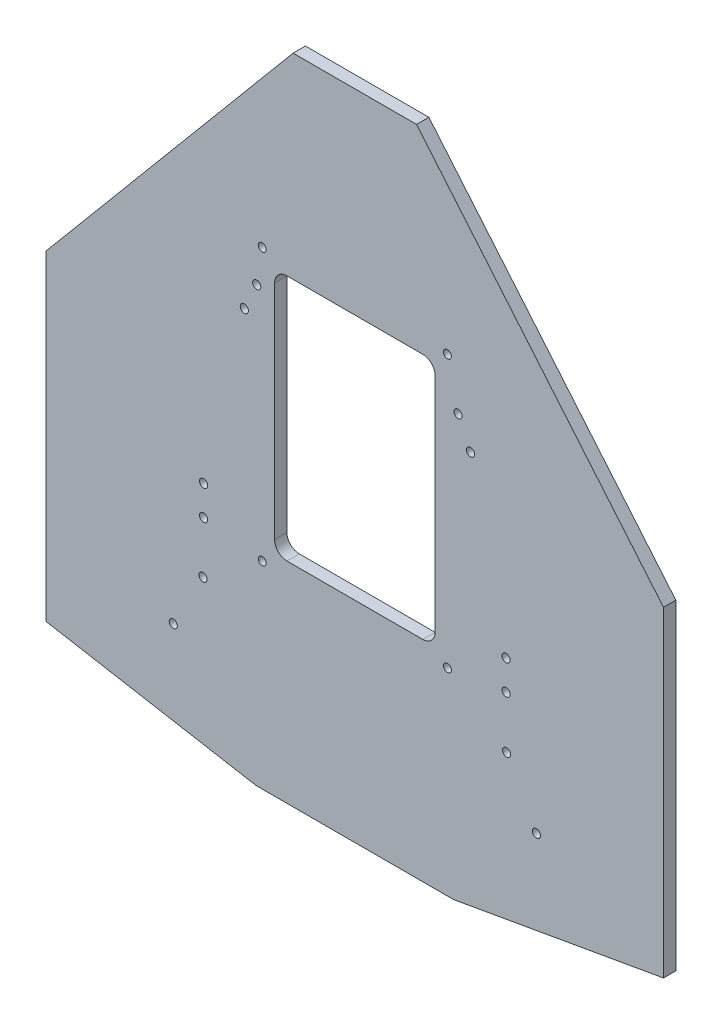
ISO-10303-21;
HEADER;
FILE_DESCRIPTION(('STEP AP214'),'2;1');
FILE_NAME('part.step','',(''),(''),'','','');
FILE_SCHEMA(('AUTOMOTIVE_DESIGN { 1 0 10303 214 1 1 1 1 }'));
ENDSEC;
DATA;
#1=APPLICATION_CONTEXT('core data for automotive mechanical design processes');
#2=APPLICATION_PROTOCOL_DEFINITION('international standard','automotive_design',2000,#1);
#3=PRODUCT_CONTEXT('',#1,'mechanical');
#4=PRODUCT('Part','Part','',(#3));
#5=PRODUCT_RELATED_PRODUCT_CATEGORY('part','',(#4));
#6=PRODUCT_DEFINITION_FORMATION('','',#4);
#7=PRODUCT_DEFINITION_CONTEXT('part definition',#1,'design');
#8=PRODUCT_DEFINITION('design','',#6,#7);
#9=PRODUCT_DEFINITION_SHAPE('','',#8);
#10=(LENGTH_UNIT() NAMED_UNIT(*) SI_UNIT(.MILLI.,.METRE.));
#11=(NAMED_UNIT(*) PLANE_ANGLE_UNIT() SI_UNIT($,.RADIAN.));
#12=(NAMED_UNIT(*) SI_UNIT($,.STERADIAN.) SOLID_ANGLE_UNIT());
#13=UNCERTAINTY_MEASURE_WITH_UNIT(LENGTH_MEASURE(1.E-05),#10,'distance_accuracy_value','');
#14=(GEOMETRIC_REPRESENTATION_CONTEXT(3) GLOBAL_UNCERTAINTY_ASSIGNED_CONTEXT((#13)) GLOBAL_UNIT_ASSIGNED_CONTEXT((#10,
#11,#12)) REPRESENTATION_CONTEXT('',''));
#15=CARTESIAN_POINT('',(0.,0.,0.));
#16=DIRECTION('',(0.,0.,1.));
#17=DIRECTION('',(1.,0.,0.));
#18=AXIS2_PLACEMENT_3D('',#15,#16,#17);
#19=CARTESIAN_POINT('',(0.,0.,5.));
#20=DIRECTION('',(0.,0.,1.));
#21=DIRECTION('',(1.,0.,0.));
#22=AXIS2_PLACEMENT_3D('',#19,#20,#21);
#23=PLANE('',#22);
#24=CARTESIAN_POINT('',(16.4710957722156,-32.9999999999997,5.));
#25=DIRECTION('',(0.,0.,1.));
#26=DIRECTION('',(1.,0.,0.));
#27=AXIS2_PLACEMENT_3D('',#24,#25,#26);
#28=CIRCLE('',#27,1.65);
#29=CARTESIAN_POINT('',(18.1210957722156,-32.9999999999997,5.));
#30=VERTEX_POINT('',#29);
#31=EDGE_CURVE('E298',#30,#30,#28,.T.);
#32=ORIENTED_EDGE('',*,*,#31,.F.);
#33=EDGE_LOOP('',(#32));
#34=FACE_BOUND('',#33,.T.);
#35=CARTESIAN_POINT('',(163.528904227811,-32.9999999999996,5.));
#36=DIRECTION('',(0.,0.,1.));
#37=DIRECTION('',(1.,0.,0.));
#38=AXIS2_PLACEMENT_3D('',#35,#36,#37);
#39=CIRCLE('',#38,1.64999999999999);
#40=CARTESIAN_POINT('',(165.178904227811,-32.9999999999996,5.));
#41=VERTEX_POINT('',#40);
#42=EDGE_CURVE('E314',#41,#41,#39,.T.);
#43=ORIENTED_EDGE('',*,*,#42,.F.);
#44=EDGE_LOOP('',(#43));
#45=FACE_BOUND('',#44,.T.);
#46=CARTESIAN_POINT('',(151.250000000029,22.3600000000004,5.));
#47=DIRECTION('',(0.,0.,1.));
#48=DIRECTION('',(1.,0.,0.));
#49=AXIS2_PLACEMENT_3D('',#46,#47,#48);
#50=CIRCLE('',#49,1.64999999999999);
#51=CARTESIAN_POINT('',(152.900000000029,22.3600000000004,5.));
#52=VERTEX_POINT('',#51);
#53=EDGE_CURVE('E317',#52,#52,#50,.T.);
#54=ORIENTED_EDGE('',*,*,#53,.F.);
#55=EDGE_LOOP('',(#54));
#56=FACE_BOUND('',#55,.T.);
#57=CARTESIAN_POINT('',(151.250000000029,10.3600000000004,5.));
#58=DIRECTION('',(0.,0.,1.));
#59=DIRECTION('',(1.,0.,0.));
#60=AXIS2_PLACEMENT_3D('',#57,#58,#59);
#61=CIRCLE('',#60,1.64999999999999);
#62=CARTESIAN_POINT('',(152.900000000029,10.3600000000004,5.));
#63=VERTEX_POINT('',#62);
#64=EDGE_CURVE('E320',#63,#63,#61,.T.);
#65=ORIENTED_EDGE('',*,*,#64,.F.);
#66=EDGE_LOOP('',(#65));
#67=FACE_BOUND('',#66,.T.);
#68=CARTESIAN_POINT('',(151.471095772246,-10.6399999999996,5.));
#69=DIRECTION('',(0.,0.,1.));
#70=DIRECTION('',(1.,0.,0.));
#71=AXIS2_PLACEMENT_3D('',#68,#69,#70);
#72=CIRCLE('',#71,1.64999999999999);
#73=CARTESIAN_POINT('',(153.121095772246,-10.6399999999996,5.));
#74=VERTEX_POINT('',#73);
#75=EDGE_CURVE('E323',#74,#74,#72,.T.);
#76=ORIENTED_EDGE('',*,*,#75,.F.);
#77=EDGE_LOOP('',(#76));
#78=FACE_BOUND('',#77,.T.);
#79=CARTESIAN_POINT('',(136.849782998851,87.3443514030201,5.));
#80=DIRECTION('',(0.,0.,1.));
#81=DIRECTION('',(1.,0.,0.));
#82=AXIS2_PLACEMENT_3D('',#79,#80,#81);
#83=CIRCLE('',#82,1.64999999999999);
#84=CARTESIAN_POINT('',(138.499782998851,87.3443514030201,5.));
#85=VERTEX_POINT('',#84);
#86=EDGE_CURVE('E326',#85,#85,#83,.T.);
#87=ORIENTED_EDGE('',*,*,#86,.F.);
#88=EDGE_LOOP('',(#87));
#89=FACE_BOUND('',#88,.T.);
#90=CARTESIAN_POINT('',(131.82108486931,98.2398640170255,5.));
#91=DIRECTION('',(0.,0.,1.));
#92=DIRECTION('',(1.,0.,0.));
#93=AXIS2_PLACEMENT_3D('',#90,#91,#92);
#94=CIRCLE('',#93,1.64999999999999);
#95=CARTESIAN_POINT('',(133.47108486931,98.2398640170255,5.));
#96=VERTEX_POINT('',#95);
#97=EDGE_CURVE('E329',#96,#96,#94,.T.);
#98=ORIENTED_EDGE('',*,*,#97,.F.);
#99=EDGE_LOOP('',(#98));
#100=FACE_BOUND('',#99,.T.);
#101=CARTESIAN_POINT('',(50.2742777327034,102.779816321387,5.));
#102=DIRECTION('',(0.,0.,1.));
#103=DIRECTION('',(1.,0.,0.));
#104=AXIS2_PLACEMENT_3D('',#101,#102,#103);
#105=CIRCLE('',#104,1.65);
#106=CARTESIAN_POINT('',(51.9242777327034,102.779816321387,5.));
#107=VERTEX_POINT('',#106);
#108=EDGE_CURVE('E332',#107,#107,#105,.T.);
#109=ORIENTED_EDGE('',*,*,#108,.F.);
#110=EDGE_LOOP('',(#109));
#111=FACE_BOUND('',#110,.T.);
#112=CARTESIAN_POINT('',(28.5289042277807,-10.6399999999997,5.));
#113=DIRECTION('',(0.,0.,1.));
#114=DIRECTION('',(1.,0.,0.));
#115=AXIS2_PLACEMENT_3D('',#112,#113,#114);
#116=CIRCLE('',#115,1.65);
#117=CARTESIAN_POINT('',(30.1789042277807,-10.6399999999997,5.));
#118=VERTEX_POINT('',#117);
#119=EDGE_CURVE('E335',#118,#118,#116,.T.);
#120=ORIENTED_EDGE('',*,*,#119,.F.);
#121=EDGE_LOOP('',(#120));
#122=FACE_BOUND('',#121,.T.);
#123=CARTESIAN_POINT('',(28.7499999999981,22.3600000000003,5.));
#124=DIRECTION('',(0.,0.,1.));
#125=DIRECTION('',(1.,0.,0.));
#126=AXIS2_PLACEMENT_3D('',#123,#124,#125);
#127=CIRCLE('',#126,1.65);
#128=CARTESIAN_POINT('',(30.3999999999981,22.3600000000003,5.));
#129=VERTEX_POINT('',#128);
#130=EDGE_CURVE('E338',#129,#129,#127,.T.);
#131=ORIENTED_EDGE('',*,*,#130,.F.);
#132=EDGE_LOOP('',(#131));
#133=FACE_BOUND('',#132,.T.);
#134=CARTESIAN_POINT('',(28.7499999999981,10.3600000000003,5.));
#135=DIRECTION('',(0.,0.,1.));
#136=DIRECTION('',(1.,0.,0.));
#137=AXIS2_PLACEMENT_3D('',#134,#135,#136);
#138=CIRCLE('',#137,1.65);
#139=CARTESIAN_POINT('',(30.3999999999981,10.3600000000003,5.));
#140=VERTEX_POINT('',#139);
#141=EDGE_CURVE('E341',#140,#140,#138,.T.);
#142=ORIENTED_EDGE('',*,*,#141,.F.);
#143=EDGE_LOOP('',(#142));
#144=FACE_BOUND('',#143,.T.);
#145=CARTESIAN_POINT('',(45.2455796031625,91.8843037073813,5.));
#146=DIRECTION('',(0.,0.,1.));
#147=DIRECTION('',(1.,0.,0.));
#148=AXIS2_PLACEMENT_3D('',#145,#146,#147);
#149=CIRCLE('',#148,1.65);
#150=CARTESIAN_POINT('',(46.8955796031625,91.8843037073813,5.));
#151=VERTEX_POINT('',#150);
#152=EDGE_CURVE('E344',#151,#151,#149,.T.);
#153=ORIENTED_EDGE('',*,*,#152,.F.);
#154=EDGE_LOOP('',(#153));
#155=FACE_BOUND('',#154,.T.);
#156=CARTESIAN_POINT('',(52.5000000000139,117.,5.));
#157=DIRECTION('',(0.,0.,1.));
#158=DIRECTION('',(1.,0.,0.));
#159=AXIS2_PLACEMENT_3D('',#156,#157,#158);
#160=CIRCLE('',#159,1.60000000003971);
#161=CARTESIAN_POINT('',(54.1000000000536,117.,5.));
#162=VERTEX_POINT('',#161);
#163=EDGE_CURVE('E307',#162,#162,#160,.T.);
#164=ORIENTED_EDGE('',*,*,#163,.F.);
#165=EDGE_LOOP('',(#164));
#166=FACE_BOUND('',#165,.T.);
#167=CARTESIAN_POINT('',(127.500000000014,6.99999999999999,5.));
#168=DIRECTION('',(0.,0.,1.));
#169=DIRECTION('',(1.,0.,0.));
#170=AXIS2_PLACEMENT_3D('',#167,#168,#169);
#171=CIRCLE('',#170,1.60000000003971);
#172=CARTESIAN_POINT('',(129.100000000054,6.99999999999999,5.));
#173=VERTEX_POINT('',#172);
#174=EDGE_CURVE('E301',#173,#173,#171,.T.);
#175=ORIENTED_EDGE('',*,*,#174,.F.);
#176=EDGE_LOOP('',(#175));
#177=FACE_BOUND('',#176,.T.);
#178=CARTESIAN_POINT('',(127.500000000014,117.,5.));
#179=DIRECTION('',(0.,0.,1.));
#180=DIRECTION('',(1.,0.,0.));
#181=AXIS2_PLACEMENT_3D('',#178,#179,#180);
#182=CIRCLE('',#181,1.60000000003971);
#183=CARTESIAN_POINT('',(129.100000000054,117.,5.));
#184=VERTEX_POINT('',#183);
#185=EDGE_CURVE('E294',#184,#184,#182,.T.);
#186=ORIENTED_EDGE('',*,*,#185,.F.);
#187=EDGE_LOOP('',(#186));
#188=FACE_BOUND('',#187,.T.);
#189=CARTESIAN_POINT('',(52.5000000000139,6.99999999999998,5.));
#190=DIRECTION('',(0.,0.,1.));
#191=DIRECTION('',(1.,0.,0.));
#192=AXIS2_PLACEMENT_3D('',#189,#190,#191);
#193=CIRCLE('',#192,1.60000000003971);
#194=CARTESIAN_POINT('',(54.1000000000536,6.99999999999998,5.));
#195=VERTEX_POINT('',#194);
#196=EDGE_CURVE('E288',#195,#195,#193,.T.);
#197=ORIENTED_EDGE('',*,*,#196,.F.);
#198=EDGE_LOOP('',(#197));
#199=FACE_BOUND('',#198,.T.);
#200=DIRECTION('',(0.,-1.,0.));
#201=VECTOR('',#200,1.);
#202=CARTESIAN_POINT('',(-34.9999999999858,-48.,5.));
#203=LINE('',#202,#201);
#204=CARTESIAN_POINT('',(-34.9999999999858,72.0000000000001,5.));
#205=VERTEX_POINT('',#204);
#206=CARTESIAN_POINT('',(-34.9999999999858,-58.,5.));
#207=VERTEX_POINT('',#206);
#208=EDGE_CURVE('E151',#205,#207,#203,.T.);
#209=ORIENTED_EDGE('',*,*,#208,.T.);
#210=DIRECTION('',(0.984783558817937,-0.173785333909048,0.));
#211=VECTOR('',#210,1.);
#212=CARTESIAN_POINT('',(-34.9999999999858,-58.,5.));
#213=LINE('',#212,#211);
#214=CARTESIAN_POINT('',(50.0000000000139,-73.,5.));
#215=VERTEX_POINT('',#214);
#216=EDGE_CURVE('E154',#207,#215,#213,.T.);
#217=ORIENTED_EDGE('',*,*,#216,.T.);
#218=DIRECTION('',(1.,0.,0.));
#219=VECTOR('',#218,1.);
#220=CARTESIAN_POINT('',(50.0000000000139,-73.,5.));
#221=LINE('',#220,#219);
#222=CARTESIAN_POINT('',(130.000000000014,-73.,5.));
#223=VERTEX_POINT('',#222);
#224=EDGE_CURVE('E175',#215,#223,#221,.T.);
#225=ORIENTED_EDGE('',*,*,#224,.T.);
#226=DIRECTION('',(0.984783558817937,0.173785333909048,0.));
#227=VECTOR('',#226,1.);
#228=CARTESIAN_POINT('',(130.000000000014,-73.,5.));
#229=LINE('',#228,#227);
#230=CARTESIAN_POINT('',(215.000000000014,-58.,5.));
#231=VERTEX_POINT('',#230);
#232=EDGE_CURVE('E177',#223,#231,#229,.T.);
#233=ORIENTED_EDGE('',*,*,#232,.T.);
#234=DIRECTION('',(0.,1.,0.));
#235=VECTOR('',#234,1.);
#236=CARTESIAN_POINT('',(215.000000000014,-58.,5.));
#237=LINE('',#236,#235);
#238=CARTESIAN_POINT('',(215.000000000014,72.0000000000001,5.));
#239=VERTEX_POINT('',#238);
#240=EDGE_CURVE('E182',#231,#239,#237,.T.);
#241=ORIENTED_EDGE('',*,*,#240,.T.);
#242=DIRECTION('',(-0.642202735348072,0.766534830722945,0.));
#243=VECTOR('',#242,1.);
#244=CARTESIAN_POINT('',(215.000000000014,72.0000000000001,5.));
#245=LINE('',#244,#243);
#246=CARTESIAN_POINT('',(115.000000000015,191.360256275999,5.));
#247=VERTEX_POINT('',#246);
#248=EDGE_CURVE('E184',#239,#247,#245,.T.);
#249=ORIENTED_EDGE('',*,*,#248,.T.);
#250=DIRECTION('',(-1.,0.,0.));
#251=VECTOR('',#250,1.);
#252=CARTESIAN_POINT('',(115.000000000015,191.360256275999,5.));
#253=LINE('',#252,#251);
#254=CARTESIAN_POINT('',(65.0000000000152,191.360256275999,5.));
#255=VERTEX_POINT('',#254);
#256=EDGE_CURVE('E186',#247,#255,#253,.T.);
#257=ORIENTED_EDGE('',*,*,#256,.T.);
#258=DIRECTION('',(-0.642202735348082,-0.766534830722937,0.));
#259=VECTOR('',#258,1.);
#260=CARTESIAN_POINT('',(65.0000000000152,191.360256275999,5.));
#261=LINE('',#260,#259);
#262=EDGE_CURVE('E157',#255,#205,#261,.T.);
#263=ORIENTED_EDGE('',*,*,#262,.T.);
#264=EDGE_LOOP('',(#209,#217,#225,#233,#241,#249,#257,#263));
#265=FACE_BOUND('',#264,.T.);
#266=DIRECTION('',(0.,-1.,0.));
#267=VECTOR('',#266,1.);
#268=CARTESIAN_POINT('',(57.5000000000139,112.,5.));
#269=LINE('',#268,#267);
#270=CARTESIAN_POINT('',(57.5000000000139,107.,5.));
#271=VERTEX_POINT('',#270);
#272=CARTESIAN_POINT('',(57.5000000000139,17.,5.));
#273=VERTEX_POINT('',#272);
#274=EDGE_CURVE('E277',#271,#273,#269,.T.);
#275=ORIENTED_EDGE('',*,*,#274,.F.);
#276=CARTESIAN_POINT('',(62.5000000000139,107.,5.));
#277=DIRECTION('',(0.,0.,1.));
#278=DIRECTION('',(1.,0.,0.));
#279=AXIS2_PLACEMENT_3D('',#276,#277,#278);
#280=CIRCLE('',#279,5.);
#281=CARTESIAN_POINT('',(62.5000000000139,112.,5.));
#282=VERTEX_POINT('',#281);
#283=EDGE_CURVE('E53',#271,#282,#280,.F.);
#284=ORIENTED_EDGE('',*,*,#283,.T.);
#285=DIRECTION('',(-1.,0.,0.));
#286=VECTOR('',#285,1.);
#287=CARTESIAN_POINT('',(122.500000000014,112.,5.));
#288=LINE('',#287,#286);
#289=CARTESIAN_POINT('',(117.500000000014,112.,5.));
#290=VERTEX_POINT('',#289);
#291=EDGE_CURVE('E270',#290,#282,#288,.T.);
#292=ORIENTED_EDGE('',*,*,#291,.F.);
#293=CARTESIAN_POINT('',(117.500000000014,107.,5.));
#294=DIRECTION('',(0.,0.,1.));
#295=DIRECTION('',(1.,0.,0.));
#296=AXIS2_PLACEMENT_3D('',#293,#294,#295);
#297=CIRCLE('',#296,5.);
#298=CARTESIAN_POINT('',(122.500000000014,107.,5.));
#299=VERTEX_POINT('',#298);
#300=EDGE_CURVE('E11',#290,#299,#297,.F.);
#301=ORIENTED_EDGE('',*,*,#300,.T.);
#302=DIRECTION('',(0.,1.,0.));
#303=VECTOR('',#302,1.);
#304=CARTESIAN_POINT('',(122.500000000014,112.,5.));
#305=LINE('',#304,#303);
#306=CARTESIAN_POINT('',(122.500000000014,17.,5.));
#307=VERTEX_POINT('',#306);
#308=EDGE_CURVE('E193',#307,#299,#305,.T.);
#309=ORIENTED_EDGE('',*,*,#308,.F.);
#310=CARTESIAN_POINT('',(117.500000000014,17.,5.));
#311=DIRECTION('',(0.,0.,1.));
#312=DIRECTION('',(1.,0.,0.));
#313=AXIS2_PLACEMENT_3D('',#310,#311,#312);
#314=CIRCLE('',#313,5.);
#315=CARTESIAN_POINT('',(117.500000000014,12.,5.));
#316=VERTEX_POINT('',#315);
#317=EDGE_CURVE('E244',#307,#316,#314,.F.);
#318=ORIENTED_EDGE('',*,*,#317,.T.);
#319=DIRECTION('',(1.,0.,0.));
#320=VECTOR('',#319,1.);
#321=CARTESIAN_POINT('',(122.500000000014,12.,5.));
#322=LINE('',#321,#320);
#323=CARTESIAN_POINT('',(62.5000000000139,12.,5.));
#324=VERTEX_POINT('',#323);
#325=EDGE_CURVE('E274',#324,#316,#322,.T.);
#326=ORIENTED_EDGE('',*,*,#325,.F.);
#327=CARTESIAN_POINT('',(62.5000000000139,17.,5.));
#328=DIRECTION('',(0.,0.,1.));
#329=DIRECTION('',(1.,0.,0.));
#330=AXIS2_PLACEMENT_3D('',#327,#328,#329);
#331=CIRCLE('',#330,5.);
#332=EDGE_CURVE('E248',#324,#273,#331,.F.);
#333=ORIENTED_EDGE('',*,*,#332,.T.);
#334=EDGE_LOOP('',(#275,#284,#292,#301,#309,#318,#326,#333));
#335=FACE_BOUND('',#334,.T.);
#336=ADVANCED_FACE('F38',(#34,#45,#56,#67,#78,#89,#100,#111,#122,#133,#144,#155,#166,#177,#188,
#199,#265,#335),#23,.T.);
#337=CARTESIAN_POINT('',(0.,0.,0.));
#338=DIRECTION('',(0.,0.,1.));
#339=DIRECTION('',(1.,0.,0.));
#340=AXIS2_PLACEMENT_3D('',#337,#338,#339);
#341=PLANE('',#340);
#342=CARTESIAN_POINT('',(16.4710957722156,-32.9999999999997,0.));
#343=DIRECTION('',(0.,0.,-1.));
#344=DIRECTION('',(-1.,0.,0.));
#345=AXIS2_PLACEMENT_3D('',#342,#343,#344);
#346=CIRCLE('',#345,1.65);
#347=CARTESIAN_POINT('',(14.8210957722156,-32.9999999999997,0.));
#348=VERTEX_POINT('',#347);
#349=EDGE_CURVE('E347',#348,#348,#346,.T.);
#350=ORIENTED_EDGE('',*,*,#349,.F.);
#351=EDGE_LOOP('',(#350));
#352=FACE_BOUND('',#351,.T.);
#353=CARTESIAN_POINT('',(163.528904227811,-32.9999999999996,0.));
#354=DIRECTION('',(0.,0.,-1.));
#355=DIRECTION('',(-1.,0.,0.));
#356=AXIS2_PLACEMENT_3D('',#353,#354,#355);
#357=CIRCLE('',#356,1.64999999999999);
#358=CARTESIAN_POINT('',(161.878904227811,-32.9999999999996,0.));
#359=VERTEX_POINT('',#358);
#360=EDGE_CURVE('E352',#359,#359,#357,.T.);
#361=ORIENTED_EDGE('',*,*,#360,.F.);
#362=EDGE_LOOP('',(#361));
#363=FACE_BOUND('',#362,.T.);
#364=CARTESIAN_POINT('',(151.250000000029,22.3600000000004,0.));
#365=DIRECTION('',(0.,0.,-1.));
#366=DIRECTION('',(-1.,0.,0.));
#367=AXIS2_PLACEMENT_3D('',#364,#365,#366);
#368=CIRCLE('',#367,1.64999999999999);
#369=CARTESIAN_POINT('',(149.600000000029,22.3600000000004,0.));
#370=VERTEX_POINT('',#369);
#371=EDGE_CURVE('E373',#370,#370,#368,.T.);
#372=ORIENTED_EDGE('',*,*,#371,.F.);
#373=EDGE_LOOP('',(#372));
#374=FACE_BOUND('',#373,.T.);
#375=CARTESIAN_POINT('',(151.250000000029,10.3600000000004,0.));
#376=DIRECTION('',(0.,0.,-1.));
#377=DIRECTION('',(-1.,0.,0.));
#378=AXIS2_PLACEMENT_3D('',#375,#376,#377);
#379=CIRCLE('',#378,1.64999999999999);
#380=CARTESIAN_POINT('',(149.600000000029,10.3600000000004,0.));
#381=VERTEX_POINT('',#380);
#382=EDGE_CURVE('E376',#381,#381,#379,.T.);
#383=ORIENTED_EDGE('',*,*,#382,.F.);
#384=EDGE_LOOP('',(#383));
#385=FACE_BOUND('',#384,.T.);
#386=CARTESIAN_POINT('',(151.471095772246,-10.6399999999996,0.));
#387=DIRECTION('',(0.,0.,-1.));
#388=DIRECTION('',(-1.,0.,0.));
#389=AXIS2_PLACEMENT_3D('',#386,#387,#388);
#390=CIRCLE('',#389,1.64999999999999);
#391=CARTESIAN_POINT('',(149.821095772246,-10.6399999999996,0.));
#392=VERTEX_POINT('',#391);
#393=EDGE_CURVE('E348',#392,#392,#390,.T.);
#394=ORIENTED_EDGE('',*,*,#393,.F.);
#395=EDGE_LOOP('',(#394));
#396=FACE_BOUND('',#395,.T.);
#397=CARTESIAN_POINT('',(136.849782998851,87.3443514030201,0.));
#398=DIRECTION('',(0.,0.,-1.));
#399=DIRECTION('',(-1.,0.,0.));
#400=AXIS2_PLACEMENT_3D('',#397,#398,#399);
#401=CIRCLE('',#400,1.64999999999999);
#402=CARTESIAN_POINT('',(135.199782998851,87.3443514030201,0.));
#403=VERTEX_POINT('',#402);
#404=EDGE_CURVE('E351',#403,#403,#401,.T.);
#405=ORIENTED_EDGE('',*,*,#404,.F.);
#406=EDGE_LOOP('',(#405));
#407=FACE_BOUND('',#406,.T.);
#408=CARTESIAN_POINT('',(131.82108486931,98.2398640170255,0.));
#409=DIRECTION('',(0.,0.,-1.));
#410=DIRECTION('',(-1.,0.,0.));
#411=AXIS2_PLACEMENT_3D('',#408,#409,#410);
#412=CIRCLE('',#411,1.64999999999999);
#413=CARTESIAN_POINT('',(130.17108486931,98.2398640170255,0.));
#414=VERTEX_POINT('',#413);
#415=EDGE_CURVE('E355',#414,#414,#412,.T.);
#416=ORIENTED_EDGE('',*,*,#415,.F.);
#417=EDGE_LOOP('',(#416));
#418=FACE_BOUND('',#417,.T.);
#419=CARTESIAN_POINT('',(50.2742777327034,102.779816321387,0.));
#420=DIRECTION('',(0.,0.,-1.));
#421=DIRECTION('',(-1.,0.,0.));
#422=AXIS2_PLACEMENT_3D('',#419,#420,#421);
#423=CIRCLE('',#422,1.65);
#424=CARTESIAN_POINT('',(48.6242777327034,102.779816321387,0.));
#425=VERTEX_POINT('',#424);
#426=EDGE_CURVE('E358',#425,#425,#423,.T.);
#427=ORIENTED_EDGE('',*,*,#426,.F.);
#428=EDGE_LOOP('',(#427));
#429=FACE_BOUND('',#428,.T.);
#430=CARTESIAN_POINT('',(28.5289042277807,-10.6399999999997,0.));
#431=DIRECTION('',(0.,0.,-1.));
#432=DIRECTION('',(-1.,0.,0.));
#433=AXIS2_PLACEMENT_3D('',#430,#431,#432);
#434=CIRCLE('',#433,1.65);
#435=CARTESIAN_POINT('',(26.8789042277807,-10.6399999999997,0.));
#436=VERTEX_POINT('',#435);
#437=EDGE_CURVE('E365',#436,#436,#434,.T.);
#438=ORIENTED_EDGE('',*,*,#437,.F.);
#439=EDGE_LOOP('',(#438));
#440=FACE_BOUND('',#439,.T.);
#441=CARTESIAN_POINT('',(28.7499999999981,22.3600000000003,0.));
#442=DIRECTION('',(0.,0.,-1.));
#443=DIRECTION('',(-1.,0.,0.));
#444=AXIS2_PLACEMENT_3D('',#441,#442,#443);
#445=CIRCLE('',#444,1.65);
#446=CARTESIAN_POINT('',(27.0999999999981,22.3600000000003,0.));
#447=VERTEX_POINT('',#446);
#448=EDGE_CURVE('E362',#447,#447,#445,.T.);
#449=ORIENTED_EDGE('',*,*,#448,.F.);
#450=EDGE_LOOP('',(#449));
#451=FACE_BOUND('',#450,.T.);
#452=CARTESIAN_POINT('',(28.7499999999981,10.3600000000003,0.));
#453=DIRECTION('',(0.,0.,-1.));
#454=DIRECTION('',(-1.,0.,0.));
#455=AXIS2_PLACEMENT_3D('',#452,#453,#454);
#456=CIRCLE('',#455,1.65);
#457=CARTESIAN_POINT('',(27.0999999999981,10.3600000000003,0.));
#458=VERTEX_POINT('',#457);
#459=EDGE_CURVE('E366',#458,#458,#456,.T.);
#460=ORIENTED_EDGE('',*,*,#459,.F.);
#461=EDGE_LOOP('',(#460));
#462=FACE_BOUND('',#461,.T.);
#463=CARTESIAN_POINT('',(45.2455796031625,91.8843037073813,0.));
#464=DIRECTION('',(0.,0.,-1.));
#465=DIRECTION('',(-1.,0.,0.));
#466=AXIS2_PLACEMENT_3D('',#463,#464,#465);
#467=CIRCLE('',#466,1.65);
#468=CARTESIAN_POINT('',(43.5955796031625,91.8843037073813,0.));
#469=VERTEX_POINT('',#468);
#470=EDGE_CURVE('E361',#469,#469,#467,.T.);
#471=ORIENTED_EDGE('',*,*,#470,.F.);
#472=EDGE_LOOP('',(#471));
#473=FACE_BOUND('',#472,.T.);
#474=CARTESIAN_POINT('',(52.5000000000139,117.,0.));
#475=DIRECTION('',(0.,0.,1.));
#476=DIRECTION('',(1.,0.,0.));
#477=AXIS2_PLACEMENT_3D('',#474,#475,#476);
#478=CIRCLE('',#477,1.60000000003971);
#479=CARTESIAN_POINT('',(54.1000000000536,117.,0.));
#480=VERTEX_POINT('',#479);
#481=EDGE_CURVE('E291',#480,#480,#478,.T.);
#482=ORIENTED_EDGE('',*,*,#481,.T.);
#483=EDGE_LOOP('',(#482));
#484=FACE_BOUND('',#483,.T.);
#485=CARTESIAN_POINT('',(127.500000000014,6.99999999999999,0.));
#486=DIRECTION('',(0.,0.,1.));
#487=DIRECTION('',(1.,0.,0.));
#488=AXIS2_PLACEMENT_3D('',#485,#486,#487);
#489=CIRCLE('',#488,1.60000000003971);
#490=CARTESIAN_POINT('',(129.100000000054,6.99999999999999,0.));
#491=VERTEX_POINT('',#490);
#492=EDGE_CURVE('E304',#491,#491,#489,.T.);
#493=ORIENTED_EDGE('',*,*,#492,.T.);
#494=EDGE_LOOP('',(#493));
#495=FACE_BOUND('',#494,.T.);
#496=CARTESIAN_POINT('',(127.500000000014,117.,0.));
#497=DIRECTION('',(0.,0.,1.));
#498=DIRECTION('',(1.,0.,0.));
#499=AXIS2_PLACEMENT_3D('',#496,#497,#498);
#500=CIRCLE('',#499,1.60000000003971);
#501=CARTESIAN_POINT('',(129.100000000054,117.,0.));
#502=VERTEX_POINT('',#501);
#503=EDGE_CURVE('E297',#502,#502,#500,.T.);
#504=ORIENTED_EDGE('',*,*,#503,.T.);
#505=EDGE_LOOP('',(#504));
#506=FACE_BOUND('',#505,.T.);
#507=CARTESIAN_POINT('',(52.5000000000139,6.99999999999998,0.));
#508=DIRECTION('',(0.,0.,1.));
#509=DIRECTION('',(1.,0.,0.));
#510=AXIS2_PLACEMENT_3D('',#507,#508,#509);
#511=CIRCLE('',#510,1.60000000003971);
#512=CARTESIAN_POINT('',(54.1000000000536,6.99999999999998,0.));
#513=VERTEX_POINT('',#512);
#514=EDGE_CURVE('E264',#513,#513,#511,.T.);
#515=ORIENTED_EDGE('',*,*,#514,.T.);
#516=EDGE_LOOP('',(#515));
#517=FACE_BOUND('',#516,.T.);
#518=DIRECTION('',(0.984783558817937,-0.173785333909048,0.));
#519=VECTOR('',#518,1.);
#520=CARTESIAN_POINT('',(-34.9999999999858,-58.,0.));
#521=LINE('',#520,#519);
#522=CARTESIAN_POINT('',(-34.9999999999858,-58.,0.));
#523=VERTEX_POINT('',#522);
#524=CARTESIAN_POINT('',(50.0000000000139,-73.,0.));
#525=VERTEX_POINT('',#524);
#526=EDGE_CURVE('E190',#523,#525,#521,.T.);
#527=ORIENTED_EDGE('',*,*,#526,.F.);
#528=DIRECTION('',(0.,-1.,0.));
#529=VECTOR('',#528,1.);
#530=CARTESIAN_POINT('',(-34.9999999999858,72.0000000000001,0.));
#531=LINE('',#530,#529);
#532=CARTESIAN_POINT('',(-34.9999999999858,72.0000000000001,0.));
#533=VERTEX_POINT('',#532);
#534=EDGE_CURVE('E161',#533,#523,#531,.T.);
#535=ORIENTED_EDGE('',*,*,#534,.F.);
#536=DIRECTION('',(-0.642202735348082,-0.766534830722937,0.));
#537=VECTOR('',#536,1.);
#538=CARTESIAN_POINT('',(65.0000000000152,191.360256275999,0.));
#539=LINE('',#538,#537);
#540=CARTESIAN_POINT('',(65.0000000000152,191.360256275999,0.));
#541=VERTEX_POINT('',#540);
#542=EDGE_CURVE('E204',#541,#533,#539,.T.);
#543=ORIENTED_EDGE('',*,*,#542,.F.);
#544=DIRECTION('',(-1.,0.,0.));
#545=VECTOR('',#544,1.);
#546=CARTESIAN_POINT('',(115.000000000015,191.360256275999,0.));
#547=LINE('',#546,#545);
#548=CARTESIAN_POINT('',(115.000000000015,191.360256275999,0.));
#549=VERTEX_POINT('',#548);
#550=EDGE_CURVE('E202',#549,#541,#547,.T.);
#551=ORIENTED_EDGE('',*,*,#550,.F.);
#552=DIRECTION('',(-0.642202735348072,0.766534830722945,0.));
#553=VECTOR('',#552,1.);
#554=CARTESIAN_POINT('',(215.000000000014,72.0000000000001,0.));
#555=LINE('',#554,#553);
#556=CARTESIAN_POINT('',(215.000000000014,72.0000000000001,0.));
#557=VERTEX_POINT('',#556);
#558=EDGE_CURVE('E200',#557,#549,#555,.T.);
#559=ORIENTED_EDGE('',*,*,#558,.F.);
#560=DIRECTION('',(0.,1.,0.));
#561=VECTOR('',#560,1.);
#562=CARTESIAN_POINT('',(215.000000000014,62.0000000000001,0.));
#563=LINE('',#562,#561);
#564=CARTESIAN_POINT('',(215.000000000014,-58.,0.));
#565=VERTEX_POINT('',#564);
#566=EDGE_CURVE('E198',#565,#557,#563,.T.);
#567=ORIENTED_EDGE('',*,*,#566,.F.);
#568=DIRECTION('',(0.984783558817937,0.173785333909048,0.));
#569=VECTOR('',#568,1.);
#570=CARTESIAN_POINT('',(130.000000000014,-73.,0.));
#571=LINE('',#570,#569);
#572=CARTESIAN_POINT('',(130.000000000014,-73.,0.));
#573=VERTEX_POINT('',#572);
#574=EDGE_CURVE('E195',#573,#565,#571,.T.);
#575=ORIENTED_EDGE('',*,*,#574,.F.);
#576=DIRECTION('',(1.,0.,0.));
#577=VECTOR('',#576,1.);
#578=CARTESIAN_POINT('',(50.0000000000139,-73.,0.));
#579=LINE('',#578,#577);
#580=EDGE_CURVE('E192',#525,#573,#579,.T.);
#581=ORIENTED_EDGE('',*,*,#580,.F.);
#582=EDGE_LOOP('',(#527,#535,#543,#551,#559,#567,#575,#581));
#583=FACE_BOUND('',#582,.T.);
#584=DIRECTION('',(0.,1.,0.));
#585=VECTOR('',#584,1.);
#586=CARTESIAN_POINT('',(122.500000000014,112.,0.));
#587=LINE('',#586,#585);
#588=CARTESIAN_POINT('',(122.500000000014,17.,0.));
#589=VERTEX_POINT('',#588);
#590=CARTESIAN_POINT('',(122.500000000014,107.,0.));
#591=VERTEX_POINT('',#590);
#592=EDGE_CURVE('E258',#589,#591,#587,.T.);
#593=ORIENTED_EDGE('',*,*,#592,.T.);
#594=CARTESIAN_POINT('',(117.500000000014,107.,0.));
#595=DIRECTION('',(0.,0.,1.));
#596=DIRECTION('',(1.,0.,0.));
#597=AXIS2_PLACEMENT_3D('',#594,#595,#596);
#598=CIRCLE('',#597,5.);
#599=CARTESIAN_POINT('',(117.500000000014,112.,0.));
#600=VERTEX_POINT('',#599);
#601=EDGE_CURVE('E46',#591,#600,#598,.T.);
#602=ORIENTED_EDGE('',*,*,#601,.T.);
#603=DIRECTION('',(-1.,0.,0.));
#604=VECTOR('',#603,1.);
#605=CARTESIAN_POINT('',(122.500000000014,112.,0.));
#606=LINE('',#605,#604);
#607=CARTESIAN_POINT('',(62.5000000000139,112.,0.));
#608=VERTEX_POINT('',#607);
#609=EDGE_CURVE('E256',#600,#608,#606,.T.);
#610=ORIENTED_EDGE('',*,*,#609,.T.);
#611=CARTESIAN_POINT('',(62.5000000000139,107.,0.));
#612=DIRECTION('',(0.,0.,1.));
#613=DIRECTION('',(1.,0.,0.));
#614=AXIS2_PLACEMENT_3D('',#611,#612,#613);
#615=CIRCLE('',#614,5.);
#616=CARTESIAN_POINT('',(57.5000000000139,107.,0.));
#617=VERTEX_POINT('',#616);
#618=EDGE_CURVE('E250',#608,#617,#615,.T.);
#619=ORIENTED_EDGE('',*,*,#618,.T.);
#620=DIRECTION('',(0.,-1.,0.));
#621=VECTOR('',#620,1.);
#622=CARTESIAN_POINT('',(57.5000000000139,112.,0.));
#623=LINE('',#622,#621);
#624=CARTESIAN_POINT('',(57.5000000000139,17.,0.));
#625=VERTEX_POINT('',#624);
#626=EDGE_CURVE('E263',#617,#625,#623,.T.);
#627=ORIENTED_EDGE('',*,*,#626,.T.);
#628=CARTESIAN_POINT('',(62.5000000000139,17.,0.));
#629=DIRECTION('',(0.,0.,1.));
#630=DIRECTION('',(1.,0.,0.));
#631=AXIS2_PLACEMENT_3D('',#628,#629,#630);
#632=CIRCLE('',#631,5.);
#633=CARTESIAN_POINT('',(62.5000000000139,12.,0.));
#634=VERTEX_POINT('',#633);
#635=EDGE_CURVE('E246',#625,#634,#632,.T.);
#636=ORIENTED_EDGE('',*,*,#635,.T.);
#637=DIRECTION('',(1.,0.,0.));
#638=VECTOR('',#637,1.);
#639=CARTESIAN_POINT('',(122.500000000014,12.,0.));
#640=LINE('',#639,#638);
#641=CARTESIAN_POINT('',(117.500000000014,12.,0.));
#642=VERTEX_POINT('',#641);
#643=EDGE_CURVE('E283',#634,#642,#640,.T.);
#644=ORIENTED_EDGE('',*,*,#643,.T.);
#645=CARTESIAN_POINT('',(117.500000000014,17.,0.));
#646=DIRECTION('',(0.,0.,1.));
#647=DIRECTION('',(1.,0.,0.));
#648=AXIS2_PLACEMENT_3D('',#645,#646,#647);
#649=CIRCLE('',#648,5.);
#650=EDGE_CURVE('E242',#642,#589,#649,.T.);
#651=ORIENTED_EDGE('',*,*,#650,.T.);
#652=EDGE_LOOP('',(#593,#602,#610,#619,#627,#636,#644,#651));
#653=FACE_BOUND('',#652,.T.);
#654=ADVANCED_FACE('F255',(#352,#363,#374,#385,#396,#407,#418,#429,#440,#451,#462,#473,#484,
#495,#506,#517,#583,#653),#341,.F.);
#655=CARTESIAN_POINT('',(-34.9999999999858,-58.,5.));
#656=DIRECTION('',(0.173785333909048,0.984783558817937,0.));
#657=DIRECTION('',(-0.984783558817937,0.173785333909048,0.));
#658=AXIS2_PLACEMENT_3D('',#655,#656,#657);
#659=PLANE('',#658);
#660=ORIENTED_EDGE('',*,*,#526,.T.);
#661=DIRECTION('',(0.,0.,-1.));
#662=VECTOR('',#661,1.);
#663=CARTESIAN_POINT('',(50.0000000000139,-73.,5.));
#664=LINE('',#663,#662);
#665=EDGE_CURVE('E170',#215,#525,#664,.T.);
#666=ORIENTED_EDGE('',*,*,#665,.F.);
#667=ORIENTED_EDGE('',*,*,#216,.F.);
#668=DIRECTION('',(0.,0.,-1.));
#669=VECTOR('',#668,1.);
#670=CARTESIAN_POINT('',(-34.9999999999858,-58.,5.));
#671=LINE('',#670,#669);
#672=EDGE_CURVE('E164',#207,#523,#671,.T.);
#673=ORIENTED_EDGE('',*,*,#672,.T.);
#674=EDGE_LOOP('',(#660,#666,#667,#673));
#675=FACE_BOUND('',#674,.T.);
#676=ADVANCED_FACE('F172',(#675),#659,.F.);
#677=CARTESIAN_POINT('',(50.0000000000139,-73.,5.));
#678=DIRECTION('',(0.,1.,0.));
#679=DIRECTION('',(0.,0.,1.));
#680=AXIS2_PLACEMENT_3D('',#677,#678,#679);
#681=PLANE('',#680);
#682=ORIENTED_EDGE('',*,*,#580,.T.);
#683=DIRECTION('',(0.,0.,-1.));
#684=VECTOR('',#683,1.);
#685=CARTESIAN_POINT('',(130.000000000014,-73.,5.));
#686=LINE('',#685,#684);
#687=EDGE_CURVE('E220',#223,#573,#686,.T.);
#688=ORIENTED_EDGE('',*,*,#687,.F.);
#689=ORIENTED_EDGE('',*,*,#224,.F.);
#690=ORIENTED_EDGE('',*,*,#665,.T.);
#691=EDGE_LOOP('',(#682,#688,#689,#690));
#692=FACE_BOUND('',#691,.T.);
#693=ADVANCED_FACE('F423',(#692),#681,.F.);
#694=CARTESIAN_POINT('',(130.000000000014,-73.,5.));
#695=DIRECTION('',(-0.173785333909048,0.984783558817937,0.));
#696=DIRECTION('',(-0.984783558817937,-0.173785333909048,0.));
#697=AXIS2_PLACEMENT_3D('',#694,#695,#696);
#698=PLANE('',#697);
#699=ORIENTED_EDGE('',*,*,#574,.T.);
#700=DIRECTION('',(0.,0.,-1.));
#701=VECTOR('',#700,1.);
#702=CARTESIAN_POINT('',(215.000000000014,-58.,5.));
#703=LINE('',#702,#701);
#704=EDGE_CURVE('E217',#231,#565,#703,.T.);
#705=ORIENTED_EDGE('',*,*,#704,.F.);
#706=ORIENTED_EDGE('',*,*,#232,.F.);
#707=ORIENTED_EDGE('',*,*,#687,.T.);
#708=EDGE_LOOP('',(#699,#705,#706,#707));
#709=FACE_BOUND('',#708,.T.);
#710=ADVANCED_FACE('F430',(#709),#698,.F.);
#711=CARTESIAN_POINT('',(215.000000000014,62.0000000000001,5.));
#712=DIRECTION('',(-1.,0.,0.));
#713=DIRECTION('',(0.,-1.,0.));
#714=AXIS2_PLACEMENT_3D('',#711,#712,#713);
#715=PLANE('',#714);
#716=ORIENTED_EDGE('',*,*,#566,.T.);
#717=DIRECTION('',(0.,0.,-1.));
#718=VECTOR('',#717,1.);
#719=CARTESIAN_POINT('',(215.000000000014,72.0000000000001,5.));
#720=LINE('',#719,#718);
#721=EDGE_CURVE('E214',#239,#557,#720,.T.);
#722=ORIENTED_EDGE('',*,*,#721,.F.);
#723=ORIENTED_EDGE('',*,*,#240,.F.);
#724=ORIENTED_EDGE('',*,*,#704,.T.);
#725=EDGE_LOOP('',(#716,#722,#723,#724));
#726=FACE_BOUND('',#725,.T.);
#727=ADVANCED_FACE('F432',(#726),#715,.F.);
#728=CARTESIAN_POINT('',(215.000000000014,72.0000000000001,5.));
#729=DIRECTION('',(-0.766534830722945,-0.642202735348072,0.));
#730=DIRECTION('',(0.642202735348072,-0.766534830722945,0.));
#731=AXIS2_PLACEMENT_3D('',#728,#729,#730);
#732=PLANE('',#731);
#733=ORIENTED_EDGE('',*,*,#558,.T.);
#734=DIRECTION('',(0.,0.,-1.));
#735=VECTOR('',#734,1.);
#736=CARTESIAN_POINT('',(115.000000000015,191.360256275999,5.));
#737=LINE('',#736,#735);
#738=EDGE_CURVE('E211',#247,#549,#737,.T.);
#739=ORIENTED_EDGE('',*,*,#738,.F.);
#740=ORIENTED_EDGE('',*,*,#248,.F.);
#741=ORIENTED_EDGE('',*,*,#721,.T.);
#742=EDGE_LOOP('',(#733,#739,#740,#741));
#743=FACE_BOUND('',#742,.T.);
#744=ADVANCED_FACE('F437',(#743),#732,.F.);
#745=CARTESIAN_POINT('',(115.000000000015,191.360256275999,5.));
#746=DIRECTION('',(0.,-1.,0.));
#747=DIRECTION('',(1.,0.,0.));
#748=AXIS2_PLACEMENT_3D('',#745,#746,#747);
#749=PLANE('',#748);
#750=ORIENTED_EDGE('',*,*,#550,.T.);
#751=DIRECTION('',(0.,0.,-1.));
#752=VECTOR('',#751,1.);
#753=CARTESIAN_POINT('',(65.0000000000152,191.360256275999,5.));
#754=LINE('',#753,#752);
#755=EDGE_CURVE('E208',#255,#541,#754,.T.);
#756=ORIENTED_EDGE('',*,*,#755,.F.);
#757=ORIENTED_EDGE('',*,*,#256,.F.);
#758=ORIENTED_EDGE('',*,*,#738,.T.);
#759=EDGE_LOOP('',(#750,#756,#757,#758));
#760=FACE_BOUND('',#759,.T.);
#761=ADVANCED_FACE('F441',(#760),#749,.F.);
#762=CARTESIAN_POINT('',(65.0000000000152,191.360256275999,5.));
#763=DIRECTION('',(0.766534830722937,-0.642202735348082,0.));
#764=DIRECTION('',(0.642202735348082,0.766534830722937,0.));
#765=AXIS2_PLACEMENT_3D('',#762,#763,#764);
#766=PLANE('',#765);
#767=ORIENTED_EDGE('',*,*,#542,.T.);
#768=DIRECTION('',(0.,0.,-1.));
#769=VECTOR('',#768,1.);
#770=CARTESIAN_POINT('',(-34.9999999999858,72.0000000000001,5.));
#771=LINE('',#770,#769);
#772=EDGE_CURVE('E189',#205,#533,#771,.T.);
#773=ORIENTED_EDGE('',*,*,#772,.F.);
#774=ORIENTED_EDGE('',*,*,#262,.F.);
#775=ORIENTED_EDGE('',*,*,#755,.T.);
#776=EDGE_LOOP('',(#767,#773,#774,#775));
#777=FACE_BOUND('',#776,.T.);
#778=ADVANCED_FACE('F444',(#777),#766,.F.);
#779=CARTESIAN_POINT('',(-34.9999999999858,72.0000000000001,5.));
#780=DIRECTION('',(1.,0.,0.));
#781=DIRECTION('',(0.,1.,0.));
#782=AXIS2_PLACEMENT_3D('',#779,#780,#781);
#783=PLANE('',#782);
#784=ORIENTED_EDGE('',*,*,#534,.T.);
#785=ORIENTED_EDGE('',*,*,#672,.F.);
#786=ORIENTED_EDGE('',*,*,#208,.F.);
#787=ORIENTED_EDGE('',*,*,#772,.T.);
#788=EDGE_LOOP('',(#784,#785,#786,#787));
#789=FACE_BOUND('',#788,.T.);
#790=ADVANCED_FACE('F165',(#789),#783,.F.);
#791=CARTESIAN_POINT('',(122.500000000014,112.,5.));
#792=DIRECTION('',(0.,-1.,0.));
#793=DIRECTION('',(1.,0.,0.));
#794=AXIS2_PLACEMENT_3D('',#791,#792,#793);
#795=PLANE('',#794);
#796=ORIENTED_EDGE('',*,*,#291,.T.);
#797=DIRECTION('',(0.,0.,-1.));
#798=VECTOR('',#797,1.);
#799=CARTESIAN_POINT('',(62.5000000000139,112.,0.));
#800=LINE('',#799,#798);
#801=EDGE_CURVE('E239',#282,#608,#800,.T.);
#802=ORIENTED_EDGE('',*,*,#801,.T.);
#803=ORIENTED_EDGE('',*,*,#609,.F.);
#804=DIRECTION('',(0.,0.,-1.));
#805=VECTOR('',#804,1.);
#806=CARTESIAN_POINT('',(117.500000000014,112.,5.));
#807=LINE('',#806,#805);
#808=EDGE_CURVE('E60',#600,#290,#807,.F.);
#809=ORIENTED_EDGE('',*,*,#808,.T.);
#810=EDGE_LOOP('',(#796,#802,#803,#809));
#811=FACE_BOUND('',#810,.T.);
#812=ADVANCED_FACE('F261',(#811),#795,.T.);
#813=CARTESIAN_POINT('',(57.5000000000139,112.,5.));
#814=DIRECTION('',(1.,0.,0.));
#815=DIRECTION('',(0.,1.,0.));
#816=AXIS2_PLACEMENT_3D('',#813,#814,#815);
#817=PLANE('',#816);
#818=ORIENTED_EDGE('',*,*,#274,.T.);
#819=DIRECTION('',(0.,0.,-1.));
#820=VECTOR('',#819,1.);
#821=CARTESIAN_POINT('',(57.5000000000139,17.,0.));
#822=LINE('',#821,#820);
#823=EDGE_CURVE('E235',#273,#625,#822,.T.);
#824=ORIENTED_EDGE('',*,*,#823,.T.);
#825=ORIENTED_EDGE('',*,*,#626,.F.);
#826=DIRECTION('',(0.,0.,-1.));
#827=VECTOR('',#826,1.);
#828=CARTESIAN_POINT('',(57.5000000000139,107.,5.));
#829=LINE('',#828,#827);
#830=EDGE_CURVE('E233',#617,#271,#829,.F.);
#831=ORIENTED_EDGE('',*,*,#830,.T.);
#832=EDGE_LOOP('',(#818,#824,#825,#831));
#833=FACE_BOUND('',#832,.T.);
#834=ADVANCED_FACE('F463',(#833),#817,.T.);
#835=CARTESIAN_POINT('',(122.500000000014,12.,5.));
#836=DIRECTION('',(0.,1.,0.));
#837=DIRECTION('',(-1.,0.,0.));
#838=AXIS2_PLACEMENT_3D('',#835,#836,#837);
#839=PLANE('',#838);
#840=ORIENTED_EDGE('',*,*,#325,.T.);
#841=DIRECTION('',(0.,0.,-1.));
#842=VECTOR('',#841,1.);
#843=CARTESIAN_POINT('',(117.500000000014,12.,0.));
#844=LINE('',#843,#842);
#845=EDGE_CURVE('E225',#316,#642,#844,.T.);
#846=ORIENTED_EDGE('',*,*,#845,.T.);
#847=ORIENTED_EDGE('',*,*,#643,.F.);
#848=DIRECTION('',(0.,0.,-1.));
#849=VECTOR('',#848,1.);
#850=CARTESIAN_POINT('',(62.5000000000139,12.,5.));
#851=LINE('',#850,#849);
#852=EDGE_CURVE('E169',#634,#324,#851,.F.);
#853=ORIENTED_EDGE('',*,*,#852,.T.);
#854=EDGE_LOOP('',(#840,#846,#847,#853));
#855=FACE_BOUND('',#854,.T.);
#856=ADVANCED_FACE('F466',(#855),#839,.T.);
#857=CARTESIAN_POINT('',(122.500000000014,112.,5.));
#858=DIRECTION('',(-1.,0.,0.));
#859=DIRECTION('',(0.,-1.,0.));
#860=AXIS2_PLACEMENT_3D('',#857,#858,#859);
#861=PLANE('',#860);
#862=ORIENTED_EDGE('',*,*,#592,.F.);
#863=DIRECTION('',(0.,0.,-1.));
#864=VECTOR('',#863,1.);
#865=CARTESIAN_POINT('',(122.500000000014,17.,5.));
#866=LINE('',#865,#864);
#867=EDGE_CURVE('E231',#589,#307,#866,.F.);
#868=ORIENTED_EDGE('',*,*,#867,.T.);
#869=ORIENTED_EDGE('',*,*,#308,.T.);
#870=DIRECTION('',(0.,0.,-1.));
#871=VECTOR('',#870,1.);
#872=CARTESIAN_POINT('',(122.500000000014,107.,0.));
#873=LINE('',#872,#871);
#874=EDGE_CURVE('E228',#299,#591,#873,.T.);
#875=ORIENTED_EDGE('',*,*,#874,.T.);
#876=EDGE_LOOP('',(#862,#868,#869,#875));
#877=FACE_BOUND('',#876,.T.);
#878=ADVANCED_FACE('F272',(#877),#861,.T.);
#879=CARTESIAN_POINT('',(52.5000000000139,6.99999999999998,0.));
#880=DIRECTION('',(0.,0.,1.));
#881=DIRECTION('',(1.,0.,0.));
#882=AXIS2_PLACEMENT_3D('',#879,#880,#881);
#883=CYLINDRICAL_SURFACE('',#882,1.60000000003971);
#884=ORIENTED_EDGE('',*,*,#514,.F.);
#885=EDGE_LOOP('',(#884));
#886=FACE_BOUND('',#885,.T.);
#887=ORIENTED_EDGE('',*,*,#196,.T.);
#888=EDGE_LOOP('',(#887));
#889=FACE_BOUND('',#888,.T.);
#890=ADVANCED_FACE('F473',(#886,#889),#883,.F.);
#891=CARTESIAN_POINT('',(127.500000000014,117.,0.));
#892=DIRECTION('',(0.,0.,1.));
#893=DIRECTION('',(1.,0.,0.));
#894=AXIS2_PLACEMENT_3D('',#891,#892,#893);
#895=CYLINDRICAL_SURFACE('',#894,1.60000000003971);
#896=ORIENTED_EDGE('',*,*,#503,.F.);
#897=EDGE_LOOP('',(#896));
#898=FACE_BOUND('',#897,.T.);
#899=ORIENTED_EDGE('',*,*,#185,.T.);
#900=EDGE_LOOP('',(#899));
#901=FACE_BOUND('',#900,.T.);
#902=ADVANCED_FACE('F476',(#898,#901),#895,.F.);
#903=CARTESIAN_POINT('',(127.500000000014,6.99999999999999,0.));
#904=DIRECTION('',(0.,0.,1.));
#905=DIRECTION('',(1.,0.,0.));
#906=AXIS2_PLACEMENT_3D('',#903,#904,#905);
#907=CYLINDRICAL_SURFACE('',#906,1.60000000003971);
#908=ORIENTED_EDGE('',*,*,#492,.F.);
#909=EDGE_LOOP('',(#908));
#910=FACE_BOUND('',#909,.T.);
#911=ORIENTED_EDGE('',*,*,#174,.T.);
#912=EDGE_LOOP('',(#911));
#913=FACE_BOUND('',#912,.T.);
#914=ADVANCED_FACE('F480',(#910,#913),#907,.F.);
#915=CARTESIAN_POINT('',(52.5000000000139,117.,0.));
#916=DIRECTION('',(0.,0.,1.));
#917=DIRECTION('',(1.,0.,0.));
#918=AXIS2_PLACEMENT_3D('',#915,#916,#917);
#919=CYLINDRICAL_SURFACE('',#918,1.60000000003971);
#920=ORIENTED_EDGE('',*,*,#481,.F.);
#921=EDGE_LOOP('',(#920));
#922=FACE_BOUND('',#921,.T.);
#923=ORIENTED_EDGE('',*,*,#163,.T.);
#924=EDGE_LOOP('',(#923));
#925=FACE_BOUND('',#924,.T.);
#926=ADVANCED_FACE('F484',(#922,#925),#919,.F.);
#927=CARTESIAN_POINT('',(117.500000000014,17.,5.));
#928=DIRECTION('',(0.,0.,1.));
#929=DIRECTION('',(1.,0.,0.));
#930=AXIS2_PLACEMENT_3D('',#927,#928,#929);
#931=CYLINDRICAL_SURFACE('',#930,5.);
#932=ORIENTED_EDGE('',*,*,#317,.F.);
#933=ORIENTED_EDGE('',*,*,#867,.F.);
#934=ORIENTED_EDGE('',*,*,#650,.F.);
#935=ORIENTED_EDGE('',*,*,#845,.F.);
#936=EDGE_LOOP('',(#932,#933,#934,#935));
#937=FACE_BOUND('',#936,.T.);
#938=ADVANCED_FACE('F488',(#937),#931,.F.);
#939=CARTESIAN_POINT('',(62.5000000000139,17.,5.));
#940=DIRECTION('',(0.,0.,1.));
#941=DIRECTION('',(1.,0.,0.));
#942=AXIS2_PLACEMENT_3D('',#939,#940,#941);
#943=CYLINDRICAL_SURFACE('',#942,5.);
#944=ORIENTED_EDGE('',*,*,#332,.F.);
#945=ORIENTED_EDGE('',*,*,#852,.F.);
#946=ORIENTED_EDGE('',*,*,#635,.F.);
#947=ORIENTED_EDGE('',*,*,#823,.F.);
#948=EDGE_LOOP('',(#944,#945,#946,#947));
#949=FACE_BOUND('',#948,.T.);
#950=ADVANCED_FACE('F595',(#949),#943,.F.);
#951=CARTESIAN_POINT('',(62.5000000000139,107.,5.));
#952=DIRECTION('',(0.,0.,1.));
#953=DIRECTION('',(1.,0.,0.));
#954=AXIS2_PLACEMENT_3D('',#951,#952,#953);
#955=CYLINDRICAL_SURFACE('',#954,5.);
#956=ORIENTED_EDGE('',*,*,#283,.F.);
#957=ORIENTED_EDGE('',*,*,#830,.F.);
#958=ORIENTED_EDGE('',*,*,#618,.F.);
#959=ORIENTED_EDGE('',*,*,#801,.F.);
#960=EDGE_LOOP('',(#956,#957,#958,#959));
#961=FACE_BOUND('',#960,.T.);
#962=ADVANCED_FACE('F589',(#961),#955,.F.);
#963=CARTESIAN_POINT('',(117.500000000014,107.,5.));
#964=DIRECTION('',(0.,0.,1.));
#965=DIRECTION('',(1.,0.,0.));
#966=AXIS2_PLACEMENT_3D('',#963,#964,#965);
#967=CYLINDRICAL_SURFACE('',#966,5.);
#968=ORIENTED_EDGE('',*,*,#300,.F.);
#969=ORIENTED_EDGE('',*,*,#808,.F.);
#970=ORIENTED_EDGE('',*,*,#601,.F.);
#971=ORIENTED_EDGE('',*,*,#874,.F.);
#972=EDGE_LOOP('',(#968,#969,#970,#971));
#973=FACE_BOUND('',#972,.T.);
#974=ADVANCED_FACE('F40',(#973),#967,.F.);
#975=CARTESIAN_POINT('',(45.2455796031625,91.8843037073813,31.));
#976=DIRECTION('',(0.,0.,-1.));
#977=DIRECTION('',(-1.,0.,0.));
#978=AXIS2_PLACEMENT_3D('',#975,#976,#977);
#979=CYLINDRICAL_SURFACE('',#978,1.65);
#980=ORIENTED_EDGE('',*,*,#152,.T.);
#981=EDGE_LOOP('',(#980));
#982=FACE_BOUND('',#981,.T.);
#983=ORIENTED_EDGE('',*,*,#470,.T.);
#984=EDGE_LOOP('',(#983));
#985=FACE_BOUND('',#984,.T.);
#986=ADVANCED_FACE('F516',(#982,#985),#979,.F.);
#987=CARTESIAN_POINT('',(28.7499999999981,10.3600000000003,31.));
#988=DIRECTION('',(0.,0.,-1.));
#989=DIRECTION('',(-1.,0.,0.));
#990=AXIS2_PLACEMENT_3D('',#987,#988,#989);
#991=CYLINDRICAL_SURFACE('',#990,1.65);
#992=ORIENTED_EDGE('',*,*,#141,.T.);
#993=EDGE_LOOP('',(#992));
#994=FACE_BOUND('',#993,.T.);
#995=ORIENTED_EDGE('',*,*,#459,.T.);
#996=EDGE_LOOP('',(#995));
#997=FACE_BOUND('',#996,.T.);
#998=ADVANCED_FACE('F511',(#994,#997),#991,.F.);
#999=CARTESIAN_POINT('',(28.7499999999981,22.3600000000003,31.));
#1000=DIRECTION('',(0.,0.,-1.));
#1001=DIRECTION('',(-1.,0.,0.));
#1002=AXIS2_PLACEMENT_3D('',#999,#1000,#1001);
#1003=CYLINDRICAL_SURFACE('',#1002,1.65);
#1004=ORIENTED_EDGE('',*,*,#130,.T.);
#1005=EDGE_LOOP('',(#1004));
#1006=FACE_BOUND('',#1005,.T.);
#1007=ORIENTED_EDGE('',*,*,#448,.T.);
#1008=EDGE_LOOP('',(#1007));
#1009=FACE_BOUND('',#1008,.T.);
#1010=ADVANCED_FACE('F508',(#1006,#1009),#1003,.F.);
#1011=CARTESIAN_POINT('',(28.5289042277807,-10.6399999999997,31.));
#1012=DIRECTION('',(0.,0.,-1.));
#1013=DIRECTION('',(-1.,0.,0.));
#1014=AXIS2_PLACEMENT_3D('',#1011,#1012,#1013);
#1015=CYLINDRICAL_SURFACE('',#1014,1.65);
#1016=ORIENTED_EDGE('',*,*,#119,.T.);
#1017=EDGE_LOOP('',(#1016));
#1018=FACE_BOUND('',#1017,.T.);
#1019=ORIENTED_EDGE('',*,*,#437,.T.);
#1020=EDGE_LOOP('',(#1019));
#1021=FACE_BOUND('',#1020,.T.);
#1022=ADVANCED_FACE('F506',(#1018,#1021),#1015,.F.);
#1023=CARTESIAN_POINT('',(50.2742777327034,102.779816321387,31.));
#1024=DIRECTION('',(0.,0.,-1.));
#1025=DIRECTION('',(-1.,0.,0.));
#1026=AXIS2_PLACEMENT_3D('',#1023,#1024,#1025);
#1027=CYLINDRICAL_SURFACE('',#1026,1.65);
#1028=ORIENTED_EDGE('',*,*,#108,.T.);
#1029=EDGE_LOOP('',(#1028));
#1030=FACE_BOUND('',#1029,.T.);
#1031=ORIENTED_EDGE('',*,*,#426,.T.);
#1032=EDGE_LOOP('',(#1031));
#1033=FACE_BOUND('',#1032,.T.);
#1034=ADVANCED_FACE('F502',(#1030,#1033),#1027,.F.);
#1035=CARTESIAN_POINT('',(131.82108486931,98.2398640170255,31.));
#1036=DIRECTION('',(0.,0.,-1.));
#1037=DIRECTION('',(-1.,0.,0.));
#1038=AXIS2_PLACEMENT_3D('',#1035,#1036,#1037);
#1039=CYLINDRICAL_SURFACE('',#1038,1.64999999999999);
#1040=ORIENTED_EDGE('',*,*,#97,.T.);
#1041=EDGE_LOOP('',(#1040));
#1042=FACE_BOUND('',#1041,.T.);
#1043=ORIENTED_EDGE('',*,*,#415,.T.);
#1044=EDGE_LOOP('',(#1043));
#1045=FACE_BOUND('',#1044,.T.);
#1046=ADVANCED_FACE('F498',(#1042,#1045),#1039,.F.);
#1047=CARTESIAN_POINT('',(136.849782998851,87.3443514030201,31.));
#1048=DIRECTION('',(0.,0.,-1.));
#1049=DIRECTION('',(-1.,0.,0.));
#1050=AXIS2_PLACEMENT_3D('',#1047,#1048,#1049);
#1051=CYLINDRICAL_SURFACE('',#1050,1.64999999999999);
#1052=ORIENTED_EDGE('',*,*,#86,.T.);
#1053=EDGE_LOOP('',(#1052));
#1054=FACE_BOUND('',#1053,.T.);
#1055=ORIENTED_EDGE('',*,*,#404,.T.);
#1056=EDGE_LOOP('',(#1055));
#1057=FACE_BOUND('',#1056,.T.);
#1058=ADVANCED_FACE('F494',(#1054,#1057),#1051,.F.);
#1059=CARTESIAN_POINT('',(151.471095772246,-10.6399999999996,31.));
#1060=DIRECTION('',(0.,0.,-1.));
#1061=DIRECTION('',(-1.,0.,0.));
#1062=AXIS2_PLACEMENT_3D('',#1059,#1060,#1061);
#1063=CYLINDRICAL_SURFACE('',#1062,1.64999999999999);
#1064=ORIENTED_EDGE('',*,*,#75,.T.);
#1065=EDGE_LOOP('',(#1064));
#1066=FACE_BOUND('',#1065,.T.);
#1067=ORIENTED_EDGE('',*,*,#393,.T.);
#1068=EDGE_LOOP('',(#1067));
#1069=FACE_BOUND('',#1068,.T.);
#1070=ADVANCED_FACE('F490',(#1066,#1069),#1063,.F.);
#1071=CARTESIAN_POINT('',(151.250000000029,10.3600000000004,31.));
#1072=DIRECTION('',(0.,0.,-1.));
#1073=DIRECTION('',(-1.,0.,0.));
#1074=AXIS2_PLACEMENT_3D('',#1071,#1072,#1073);
#1075=CYLINDRICAL_SURFACE('',#1074,1.64999999999999);
#1076=ORIENTED_EDGE('',*,*,#64,.T.);
#1077=EDGE_LOOP('',(#1076));
#1078=FACE_BOUND('',#1077,.T.);
#1079=ORIENTED_EDGE('',*,*,#382,.T.);
#1080=EDGE_LOOP('',(#1079));
#1081=FACE_BOUND('',#1080,.T.);
#1082=ADVANCED_FACE('F493',(#1078,#1081),#1075,.F.);
#1083=CARTESIAN_POINT('',(151.250000000029,22.3600000000004,31.));
#1084=DIRECTION('',(0.,0.,-1.));
#1085=DIRECTION('',(-1.,0.,0.));
#1086=AXIS2_PLACEMENT_3D('',#1083,#1084,#1085);
#1087=CYLINDRICAL_SURFACE('',#1086,1.64999999999999);
#1088=ORIENTED_EDGE('',*,*,#53,.T.);
#1089=EDGE_LOOP('',(#1088));
#1090=FACE_BOUND('',#1089,.T.);
#1091=ORIENTED_EDGE('',*,*,#371,.T.);
#1092=EDGE_LOOP('',(#1091));
#1093=FACE_BOUND('',#1092,.T.);
#1094=ADVANCED_FACE('F523',(#1090,#1093),#1087,.F.);
#1095=CARTESIAN_POINT('',(163.528904227811,-32.9999999999996,31.));
#1096=DIRECTION('',(0.,0.,-1.));
#1097=DIRECTION('',(-1.,0.,0.));
#1098=AXIS2_PLACEMENT_3D('',#1095,#1096,#1097);
#1099=CYLINDRICAL_SURFACE('',#1098,1.64999999999999);
#1100=ORIENTED_EDGE('',*,*,#42,.T.);
#1101=EDGE_LOOP('',(#1100));
#1102=FACE_BOUND('',#1101,.T.);
#1103=ORIENTED_EDGE('',*,*,#360,.T.);
#1104=EDGE_LOOP('',(#1103));
#1105=FACE_BOUND('',#1104,.T.);
#1106=ADVANCED_FACE('F526',(#1102,#1105),#1099,.F.);
#1107=CARTESIAN_POINT('',(16.4710957722156,-32.9999999999997,31.));
#1108=DIRECTION('',(0.,0.,-1.));
#1109=DIRECTION('',(-1.,0.,0.));
#1110=AXIS2_PLACEMENT_3D('',#1107,#1108,#1109);
#1111=CYLINDRICAL_SURFACE('',#1110,1.65);
#1112=ORIENTED_EDGE('',*,*,#31,.T.);
#1113=EDGE_LOOP('',(#1112));
#1114=FACE_BOUND('',#1113,.T.);
#1115=ORIENTED_EDGE('',*,*,#349,.T.);
#1116=EDGE_LOOP('',(#1115));
#1117=FACE_BOUND('',#1116,.T.);
#1118=ADVANCED_FACE('F384',(#1114,#1117),#1111,.F.);
#1119=CLOSED_SHELL('',(#336,#654,#676,#693,#710,#727,#744,#761,#778,#790,#812,#834,#856,#878,
#890,#902,#914,#926,#938,#950,#962,#974,#986,#998,#1010,#1022,#1034,#1046,#1058,#1070,#1082,
#1094,#1106,#1118));
#1120=MANIFOLD_SOLID_BREP('B2',#1119);
#1121=ADVANCED_BREP_SHAPE_REPRESENTATION('',(#18,#1120),#14);
#1122=SHAPE_DEFINITION_REPRESENTATION(#9,#1121);
ENDSEC;
END-ISO-10303-21;
